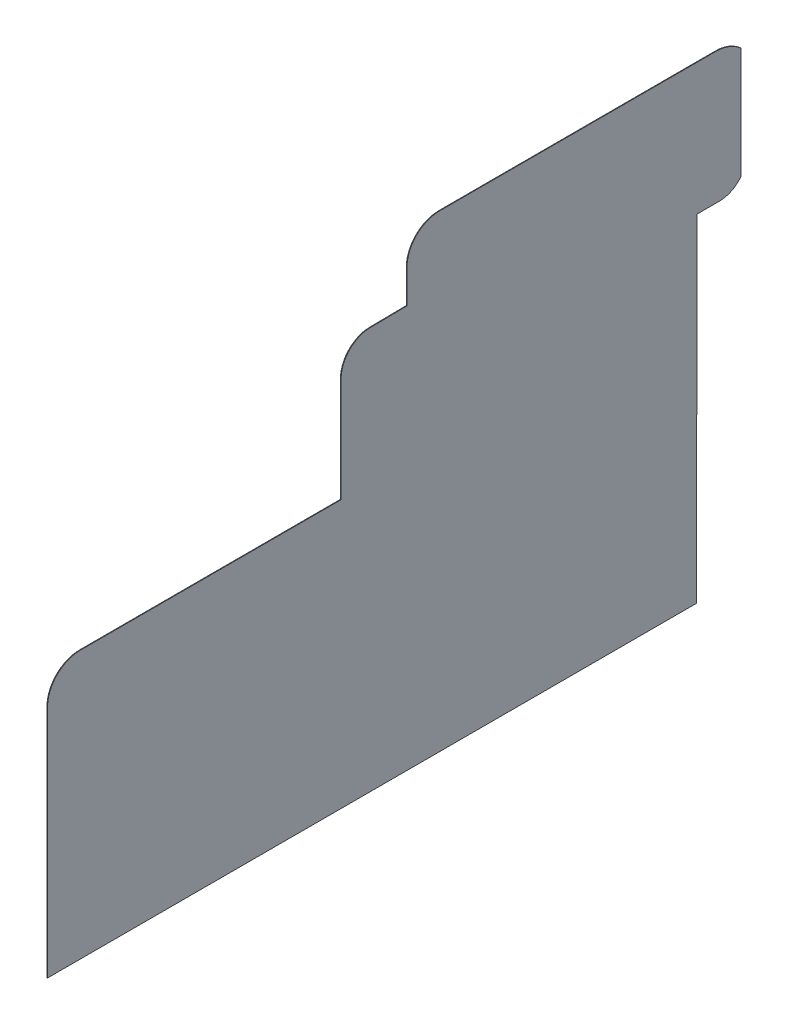
ISO-10303-21;
HEADER;
FILE_DESCRIPTION(('STEP AP214'),'2;1');
FILE_NAME('part.step','',(''),(''),'','','');
FILE_SCHEMA(('AUTOMOTIVE_DESIGN { 1 0 10303 214 1 1 1 1 }'));
ENDSEC;
DATA;
#1=APPLICATION_CONTEXT('core data for automotive mechanical design processes');
#2=APPLICATION_PROTOCOL_DEFINITION('international standard','automotive_design',2000,#1);
#3=PRODUCT_CONTEXT('',#1,'mechanical');
#4=PRODUCT('Part','Part','',(#3));
#5=PRODUCT_RELATED_PRODUCT_CATEGORY('part','',(#4));
#6=PRODUCT_DEFINITION_FORMATION('','',#4);
#7=PRODUCT_DEFINITION_CONTEXT('part definition',#1,'design');
#8=PRODUCT_DEFINITION('design','',#6,#7);
#9=PRODUCT_DEFINITION_SHAPE('','',#8);
#10=(LENGTH_UNIT() NAMED_UNIT(*) SI_UNIT(.MILLI.,.METRE.));
#11=(NAMED_UNIT(*) PLANE_ANGLE_UNIT() SI_UNIT($,.RADIAN.));
#12=(NAMED_UNIT(*) SI_UNIT($,.STERADIAN.) SOLID_ANGLE_UNIT());
#13=UNCERTAINTY_MEASURE_WITH_UNIT(LENGTH_MEASURE(1.E-05),#10,'distance_accuracy_value','');
#14=(GEOMETRIC_REPRESENTATION_CONTEXT(3) GLOBAL_UNCERTAINTY_ASSIGNED_CONTEXT((#13)) GLOBAL_UNIT_ASSIGNED_CONTEXT((#10,
#11,#12)) REPRESENTATION_CONTEXT('',''));
#15=CARTESIAN_POINT('',(0.,0.,0.));
#16=DIRECTION('',(0.,0.,1.));
#17=DIRECTION('',(1.,0.,0.));
#18=AXIS2_PLACEMENT_3D('',#15,#16,#17);
#19=CARTESIAN_POINT('',(0.001,0.617565449706493,0.598278303098278));
#20=DIRECTION('',(-1.,0.,0.));
#21=DIRECTION('',(0.,0.,1.));
#22=AXIS2_PLACEMENT_3D('',#19,#20,#21);
#23=CYLINDRICAL_SURFACE('',#22,0.047922387511738);
#24=CARTESIAN_POINT('',(0.,0.617565449706493,0.598278303098278));
#25=DIRECTION('',(1.,0.,0.));
#26=DIRECTION('',(0.,0.,-1.));
#27=AXIS2_PLACEMENT_3D('',#24,#25,#26);
#28=CIRCLE('',#27,0.047922387511738);
#29=CARTESIAN_POINT('',(0.,0.665484439081846,0.598848988712254));
#30=VERTEX_POINT('',#29);
#31=CARTESIAN_POINT('',(0.,0.617565449706493,0.646200690610016));
#32=VERTEX_POINT('',#31);
#33=EDGE_CURVE('E181',#30,#32,#28,.T.);
#34=ORIENTED_EDGE('',*,*,#33,.T.);
#35=DIRECTION('',(-1.,0.,0.));
#36=VECTOR('',#35,1.);
#37=CARTESIAN_POINT('',(0.001,0.617565449706493,0.646200690610016));
#38=LINE('',#37,#36);
#39=CARTESIAN_POINT('',(0.001,0.617565449706493,0.646200690610016));
#40=VERTEX_POINT('',#39);
#41=EDGE_CURVE('E11',#40,#32,#38,.T.);
#42=ORIENTED_EDGE('',*,*,#41,.F.);
#43=CARTESIAN_POINT('',(0.001,0.617565449706493,0.598278303098278));
#44=DIRECTION('',(1.,0.,0.));
#45=DIRECTION('',(0.,0.,-1.));
#46=AXIS2_PLACEMENT_3D('',#43,#44,#45);
#47=CIRCLE('',#46,0.047922387511738);
#48=CARTESIAN_POINT('',(0.001,0.665484439081846,0.598848988712254));
#49=VERTEX_POINT('',#48);
#50=EDGE_CURVE('E209',#49,#40,#47,.T.);
#51=ORIENTED_EDGE('',*,*,#50,.F.);
#52=DIRECTION('',(-1.,0.,0.));
#53=VECTOR('',#52,1.);
#54=CARTESIAN_POINT('',(0.001,0.665484439081846,0.598848988712254));
#55=LINE('',#54,#53);
#56=EDGE_CURVE('E177',#49,#30,#55,.T.);
#57=ORIENTED_EDGE('',*,*,#56,.T.);
#58=EDGE_LOOP('',(#34,#42,#51,#57));
#59=FACE_BOUND('',#58,.T.);
#60=ADVANCED_FACE('F43',(#59),#23,.T.);
#61=CARTESIAN_POINT('',(0.001,0.617565449706493,0.646200690610016));
#62=DIRECTION('',(0.,0.,-1.));
#63=DIRECTION('',(0.,1.,0.));
#64=AXIS2_PLACEMENT_3D('',#61,#62,#63);
#65=PLANE('',#64);
#66=DIRECTION('',(0.,-1.,0.));
#67=VECTOR('',#66,1.);
#68=CARTESIAN_POINT('',(0.,0.617565449706493,0.646200690610016));
#69=LINE('',#68,#67);
#70=CARTESIAN_POINT('',(0.,0.448266137491081,0.646200690610016));
#71=VERTEX_POINT('',#70);
#72=EDGE_CURVE('E184',#32,#71,#69,.T.);
#73=ORIENTED_EDGE('',*,*,#72,.T.);
#74=DIRECTION('',(-1.,0.,0.));
#75=VECTOR('',#74,1.);
#76=CARTESIAN_POINT('',(0.001,0.448266137491081,0.646200690610016));
#77=LINE('',#76,#75);
#78=CARTESIAN_POINT('',(0.001,0.448266137491081,0.646200690610016));
#79=VERTEX_POINT('',#78);
#80=EDGE_CURVE('E51',#79,#71,#77,.T.);
#81=ORIENTED_EDGE('',*,*,#80,.F.);
#82=DIRECTION('',(0.,-1.,0.));
#83=VECTOR('',#82,1.);
#84=CARTESIAN_POINT('',(0.001,0.617565449706493,0.646200690610016));
#85=LINE('',#84,#83);
#86=EDGE_CURVE('E123',#40,#79,#85,.T.);
#87=ORIENTED_EDGE('',*,*,#86,.F.);
#88=ORIENTED_EDGE('',*,*,#41,.T.);
#89=EDGE_LOOP('',(#73,#81,#87,#88));
#90=FACE_BOUND('',#89,.T.);
#91=ADVANCED_FACE('F302',(#90),#65,.F.);
#92=CARTESIAN_POINT('',(0.001,0.448266137491081,1.06757272863481));
#93=DIRECTION('',(0.,-1.,0.));
#94=DIRECTION('',(0.,0.,-1.));
#95=AXIS2_PLACEMENT_3D('',#92,#93,#94);
#96=PLANE('',#95);
#97=DIRECTION('',(0.,0.,1.));
#98=VECTOR('',#97,1.);
#99=CARTESIAN_POINT('',(0.,0.448266137491081,1.06757272863481));
#100=LINE('',#99,#98);
#101=CARTESIAN_POINT('',(0.,0.448266137491081,1.06757272863481));
#102=VERTEX_POINT('',#101);
#103=EDGE_CURVE('E186',#71,#102,#100,.T.);
#104=ORIENTED_EDGE('',*,*,#103,.T.);
#105=DIRECTION('',(-1.,0.,0.));
#106=VECTOR('',#105,1.);
#107=CARTESIAN_POINT('',(0.001,0.448266137491081,1.06757272863481));
#108=LINE('',#107,#106);
#109=CARTESIAN_POINT('',(0.001,0.448266137491081,1.06757272863481));
#110=VERTEX_POINT('',#109);
#111=EDGE_CURVE('E237',#110,#102,#108,.T.);
#112=ORIENTED_EDGE('',*,*,#111,.F.);
#113=DIRECTION('',(0.,0.,1.));
#114=VECTOR('',#113,1.);
#115=CARTESIAN_POINT('',(0.001,0.448266137491081,1.06757272863481));
#116=LINE('',#115,#114);
#117=EDGE_CURVE('E245',#79,#110,#116,.T.);
#118=ORIENTED_EDGE('',*,*,#117,.F.);
#119=ORIENTED_EDGE('',*,*,#80,.T.);
#120=EDGE_LOOP('',(#104,#112,#118,#119));
#121=FACE_BOUND('',#120,.T.);
#122=ADVANCED_FACE('F243',(#121),#96,.F.);
#123=CARTESIAN_POINT('',(0.001,0.395388308892973,1.06757272863481));
#124=DIRECTION('',(-1.,0.,0.));
#125=DIRECTION('',(0.,0.,1.));
#126=AXIS2_PLACEMENT_3D('',#123,#124,#125);
#127=CYLINDRICAL_SURFACE('',#126,0.0528778285981081);
#128=CARTESIAN_POINT('',(0.,0.395388308892973,1.06757272863481));
#129=DIRECTION('',(1.,0.,0.));
#130=DIRECTION('',(0.,0.,-1.));
#131=AXIS2_PLACEMENT_3D('',#128,#129,#130);
#132=CIRCLE('',#131,0.0528778285981081);
#133=CARTESIAN_POINT('',(0.,0.395388308892973,1.12045055723292));
#134=VERTEX_POINT('',#133);
#135=EDGE_CURVE('E188',#102,#134,#132,.T.);
#136=ORIENTED_EDGE('',*,*,#135,.T.);
#137=DIRECTION('',(-1.,0.,0.));
#138=VECTOR('',#137,1.);
#139=CARTESIAN_POINT('',(0.001,0.395388308892973,1.12045055723292));
#140=LINE('',#139,#138);
#141=CARTESIAN_POINT('',(0.001,0.395388308892973,1.12045055723292));
#142=VERTEX_POINT('',#141);
#143=EDGE_CURVE('E234',#142,#134,#140,.T.);
#144=ORIENTED_EDGE('',*,*,#143,.F.);
#145=CARTESIAN_POINT('',(0.001,0.395388308892973,1.06757272863481));
#146=DIRECTION('',(1.,0.,0.));
#147=DIRECTION('',(0.,0.,-1.));
#148=AXIS2_PLACEMENT_3D('',#145,#146,#147);
#149=CIRCLE('',#148,0.0528778285981081);
#150=EDGE_CURVE('E263',#110,#142,#149,.T.);
#151=ORIENTED_EDGE('',*,*,#150,.F.);
#152=ORIENTED_EDGE('',*,*,#111,.T.);
#153=EDGE_LOOP('',(#136,#144,#151,#152));
#154=FACE_BOUND('',#153,.T.);
#155=ADVANCED_FACE('F254',(#154),#127,.T.);
#156=CARTESIAN_POINT('',(0.001,0.0160830449312925,1.12045055723292));
#157=DIRECTION('',(0.,0.,-1.));
#158=DIRECTION('',(-1.,0.,0.));
#159=AXIS2_PLACEMENT_3D('',#156,#157,#158);
#160=PLANE('',#159);
#161=DIRECTION('',(0.,-1.,0.));
#162=VECTOR('',#161,1.);
#163=CARTESIAN_POINT('',(0.,0.0160830449312925,1.12045055723292));
#164=LINE('',#163,#162);
#165=CARTESIAN_POINT('',(0.,0.0160830449312925,1.12045055723292));
#166=VERTEX_POINT('',#165);
#167=EDGE_CURVE('E190',#134,#166,#164,.T.);
#168=ORIENTED_EDGE('',*,*,#167,.T.);
#169=DIRECTION('',(-1.,0.,0.));
#170=VECTOR('',#169,1.);
#171=CARTESIAN_POINT('',(0.001,0.0160830449312925,1.12045055723292));
#172=LINE('',#171,#170);
#173=CARTESIAN_POINT('',(0.001,0.0160830449312925,1.12045055723292));
#174=VERTEX_POINT('',#173);
#175=EDGE_CURVE('E231',#174,#166,#172,.T.);
#176=ORIENTED_EDGE('',*,*,#175,.F.);
#177=DIRECTION('',(0.,-1.,0.));
#178=VECTOR('',#177,1.);
#179=CARTESIAN_POINT('',(0.001,0.0160830449312925,1.12045055723292));
#180=LINE('',#179,#178);
#181=EDGE_CURVE('E260',#142,#174,#180,.T.);
#182=ORIENTED_EDGE('',*,*,#181,.F.);
#183=ORIENTED_EDGE('',*,*,#143,.T.);
#184=EDGE_LOOP('',(#168,#176,#182,#183));
#185=FACE_BOUND('',#184,.T.);
#186=ADVANCED_FACE('F258',(#185),#160,.F.);
#187=CARTESIAN_POINT('',(0.001,0.0160830449312925,1.12045055723292));
#188=DIRECTION('',(0.,1.,0.));
#189=DIRECTION('',(0.,0.,1.));
#190=AXIS2_PLACEMENT_3D('',#187,#188,#189);
#191=PLANE('',#190);
#192=DIRECTION('',(0.,0.,-1.));
#193=VECTOR('',#192,1.);
#194=CARTESIAN_POINT('',(0.,0.0160830449312925,1.12045055723292));
#195=LINE('',#194,#193);
#196=CARTESIAN_POINT('',(0.,0.0160830449312925,0.0719620734453201));
#197=VERTEX_POINT('',#196);
#198=EDGE_CURVE('E192',#166,#197,#195,.T.);
#199=ORIENTED_EDGE('',*,*,#198,.T.);
#200=DIRECTION('',(-1.,0.,0.));
#201=VECTOR('',#200,1.);
#202=CARTESIAN_POINT('',(0.001,0.0160830449312925,0.0719620734453201));
#203=LINE('',#202,#201);
#204=CARTESIAN_POINT('',(0.001,0.0160830449312925,0.0719620734453201));
#205=VERTEX_POINT('',#204);
#206=EDGE_CURVE('E228',#205,#197,#203,.T.);
#207=ORIENTED_EDGE('',*,*,#206,.F.);
#208=DIRECTION('',(0.,0.,-1.));
#209=VECTOR('',#208,1.);
#210=CARTESIAN_POINT('',(0.001,0.0160830449312925,1.12045055723292));
#211=LINE('',#210,#209);
#212=EDGE_CURVE('E262',#174,#205,#211,.T.);
#213=ORIENTED_EDGE('',*,*,#212,.F.);
#214=ORIENTED_EDGE('',*,*,#175,.T.);
#215=EDGE_LOOP('',(#199,#207,#213,#214));
#216=FACE_BOUND('',#215,.T.);
#217=ADVANCED_FACE('F315',(#216),#191,.F.);
#218=CARTESIAN_POINT('',(0.001,0.560205340385437,0.0712221041321754));
#219=DIRECTION('',(0.,0.001359930727104,0.999999075293781));
#220=DIRECTION('',(0.,-0.999999075293781,0.001359930727104));
#221=AXIS2_PLACEMENT_3D('',#218,#219,#220);
#222=PLANE('',#221);
#223=DIRECTION('',(0.,0.999999075293781,-0.001359930727104));
#224=VECTOR('',#223,1.);
#225=CARTESIAN_POINT('',(0.,0.560205340385437,0.0712221041321754));
#226=LINE('',#225,#224);
#227=CARTESIAN_POINT('',(0.,0.560205340385437,0.0712221041321754));
#228=VERTEX_POINT('',#227);
#229=EDGE_CURVE('E194',#197,#228,#226,.T.);
#230=ORIENTED_EDGE('',*,*,#229,.T.);
#231=DIRECTION('',(-1.,0.,0.));
#232=VECTOR('',#231,1.);
#233=CARTESIAN_POINT('',(0.001,0.560205340385437,0.0712221041321754));
#234=LINE('',#233,#232);
#235=CARTESIAN_POINT('',(0.001,0.560205340385437,0.0712221041321754));
#236=VERTEX_POINT('',#235);
#237=EDGE_CURVE('E225',#236,#228,#234,.T.);
#238=ORIENTED_EDGE('',*,*,#237,.F.);
#239=DIRECTION('',(0.,0.999999075293781,-0.001359930727104));
#240=VECTOR('',#239,1.);
#241=CARTESIAN_POINT('',(0.001,0.560205340385437,0.0712221041321754));
#242=LINE('',#241,#240);
#243=EDGE_CURVE('E265',#205,#236,#242,.T.);
#244=ORIENTED_EDGE('',*,*,#243,.F.);
#245=ORIENTED_EDGE('',*,*,#206,.T.);
#246=EDGE_LOOP('',(#230,#238,#244,#245));
#247=FACE_BOUND('',#246,.T.);
#248=ADVANCED_FACE('F318',(#247),#222,.F.);
#249=CARTESIAN_POINT('',(0.001,0.560205340385437,0.035147663205862));
#250=DIRECTION('',(0.,1.,0.));
#251=DIRECTION('',(0.,0.,1.));
#252=AXIS2_PLACEMENT_3D('',#249,#250,#251);
#253=PLANE('',#252);
#254=DIRECTION('',(0.,0.,-1.));
#255=VECTOR('',#254,1.);
#256=CARTESIAN_POINT('',(0.,0.560205340385437,0.035147663205862));
#257=LINE('',#256,#255);
#258=CARTESIAN_POINT('',(0.,0.560205340385437,0.035147663205862));
#259=VERTEX_POINT('',#258);
#260=EDGE_CURVE('E196',#228,#259,#257,.T.);
#261=ORIENTED_EDGE('',*,*,#260,.T.);
#262=DIRECTION('',(-1.,0.,0.));
#263=VECTOR('',#262,1.);
#264=CARTESIAN_POINT('',(0.001,0.560205340385437,0.035147663205862));
#265=LINE('',#264,#263);
#266=CARTESIAN_POINT('',(0.001,0.560205340385437,0.035147663205862));
#267=VERTEX_POINT('',#266);
#268=EDGE_CURVE('E222',#267,#259,#265,.T.);
#269=ORIENTED_EDGE('',*,*,#268,.F.);
#270=DIRECTION('',(0.,0.,-1.));
#271=VECTOR('',#270,1.);
#272=CARTESIAN_POINT('',(0.001,0.560205340385437,0.035147663205862));
#273=LINE('',#272,#271);
#274=EDGE_CURVE('E271',#236,#267,#273,.T.);
#275=ORIENTED_EDGE('',*,*,#274,.F.);
#276=ORIENTED_EDGE('',*,*,#237,.T.);
#277=EDGE_LOOP('',(#261,#269,#275,#276));
#278=FACE_BOUND('',#277,.T.);
#279=ADVANCED_FACE('F322',(#278),#253,.F.);
#280=CARTESIAN_POINT('',(0.001,0.604479450122509,0.035147663205862));
#281=DIRECTION('',(-1.,0.,0.));
#282=DIRECTION('',(0.,0.,1.));
#283=AXIS2_PLACEMENT_3D('',#280,#281,#282);
#284=CYLINDRICAL_SURFACE('',#283,0.0442741097370722);
#285=CARTESIAN_POINT('',(0.,0.604479450122509,0.035147663205862));
#286=DIRECTION('',(1.,0.,0.));
#287=DIRECTION('',(0.,0.,-1.));
#288=AXIS2_PLACEMENT_3D('',#285,#286,#287);
#289=CIRCLE('',#288,0.0442741097370722);
#290=CARTESIAN_POINT('',(0.,0.577556624041698,0.));
#291=VERTEX_POINT('',#290);
#292=EDGE_CURVE('E198',#259,#291,#289,.T.);
#293=ORIENTED_EDGE('',*,*,#292,.T.);
#294=DIRECTION('',(-1.,0.,0.));
#295=VECTOR('',#294,1.);
#296=CARTESIAN_POINT('',(0.001,0.577556624041698,0.));
#297=LINE('',#296,#295);
#298=CARTESIAN_POINT('',(0.001,0.577556624041698,0.));
#299=VERTEX_POINT('',#298);
#300=EDGE_CURVE('E219',#299,#291,#297,.T.);
#301=ORIENTED_EDGE('',*,*,#300,.F.);
#302=CARTESIAN_POINT('',(0.001,0.604479450122509,0.035147663205862));
#303=DIRECTION('',(1.,0.,0.));
#304=DIRECTION('',(0.,0.,-1.));
#305=AXIS2_PLACEMENT_3D('',#302,#303,#304);
#306=CIRCLE('',#305,0.0442741097370722);
#307=EDGE_CURVE('E273',#267,#299,#306,.T.);
#308=ORIENTED_EDGE('',*,*,#307,.F.);
#309=ORIENTED_EDGE('',*,*,#268,.T.);
#310=EDGE_LOOP('',(#293,#301,#308,#309));
#311=FACE_BOUND('',#310,.T.);
#312=ADVANCED_FACE('F326',(#311),#284,.T.);
#313=CARTESIAN_POINT('',(0.001,0.756828486919403,0.));
#314=DIRECTION('',(0.,0.,1.));
#315=DIRECTION('',(0.,-1.,0.));
#316=AXIS2_PLACEMENT_3D('',#313,#314,#315);
#317=PLANE('',#316);
#318=DIRECTION('',(0.,1.,0.));
#319=VECTOR('',#318,1.);
#320=CARTESIAN_POINT('',(0.,0.756828486919403,0.));
#321=LINE('',#320,#319);
#322=CARTESIAN_POINT('',(0.,0.756828486919403,0.));
#323=VERTEX_POINT('',#322);
#324=EDGE_CURVE('E200',#291,#323,#321,.T.);
#325=ORIENTED_EDGE('',*,*,#324,.T.);
#326=DIRECTION('',(-1.,0.,0.));
#327=VECTOR('',#326,1.);
#328=CARTESIAN_POINT('',(0.001,0.756828486919403,0.));
#329=LINE('',#328,#327);
#330=CARTESIAN_POINT('',(0.001,0.756828486919403,0.));
#331=VERTEX_POINT('',#330);
#332=EDGE_CURVE('E216',#331,#323,#329,.T.);
#333=ORIENTED_EDGE('',*,*,#332,.F.);
#334=DIRECTION('',(0.,1.,0.));
#335=VECTOR('',#334,1.);
#336=CARTESIAN_POINT('',(0.001,0.756828486919403,0.));
#337=LINE('',#336,#335);
#338=EDGE_CURVE('E275',#299,#331,#337,.T.);
#339=ORIENTED_EDGE('',*,*,#338,.F.);
#340=ORIENTED_EDGE('',*,*,#300,.T.);
#341=EDGE_LOOP('',(#325,#333,#339,#340));
#342=FACE_BOUND('',#341,.T.);
#343=ADVANCED_FACE('F330',(#342),#317,.F.);
#344=CARTESIAN_POINT('',(0.001,0.711730574750211,0.0410671532154083));
#345=DIRECTION('',(-1.,0.,0.));
#346=DIRECTION('',(0.,0.,1.));
#347=AXIS2_PLACEMENT_3D('',#344,#345,#346);
#348=CYLINDRICAL_SURFACE('',#347,0.0609945305354339);
#349=CARTESIAN_POINT('',(0.,0.711730574750211,0.0410671532154083));
#350=DIRECTION('',(1.,0.,0.));
#351=DIRECTION('',(0.,0.,1.));
#352=AXIS2_PLACEMENT_3D('',#349,#350,#351);
#353=CIRCLE('',#352,0.0609945305354339);
#354=CARTESIAN_POINT('',(0.,0.772725105285645,0.0410671532154083));
#355=VERTEX_POINT('',#354);
#356=EDGE_CURVE('E202',#323,#355,#353,.T.);
#357=ORIENTED_EDGE('',*,*,#356,.T.);
#358=DIRECTION('',(-1.,0.,0.));
#359=VECTOR('',#358,1.);
#360=CARTESIAN_POINT('',(0.001,0.772725105285645,0.0410671532154083));
#361=LINE('',#360,#359);
#362=CARTESIAN_POINT('',(0.001,0.772725105285645,0.0410671532154083));
#363=VERTEX_POINT('',#362);
#364=EDGE_CURVE('E213',#363,#355,#361,.T.);
#365=ORIENTED_EDGE('',*,*,#364,.F.);
#366=CARTESIAN_POINT('',(0.001,0.711730574750211,0.0410671532154083));
#367=DIRECTION('',(1.,0.,0.));
#368=DIRECTION('',(0.,0.,1.));
#369=AXIS2_PLACEMENT_3D('',#366,#367,#368);
#370=CIRCLE('',#369,0.0609945305354339);
#371=EDGE_CURVE('E277',#331,#363,#370,.T.);
#372=ORIENTED_EDGE('',*,*,#371,.F.);
#373=ORIENTED_EDGE('',*,*,#332,.T.);
#374=EDGE_LOOP('',(#357,#365,#372,#373));
#375=FACE_BOUND('',#374,.T.);
#376=ADVANCED_FACE('F283',(#375),#348,.T.);
#377=CARTESIAN_POINT('',(0.001,0.772725105285645,0.487234324216843));
#378=DIRECTION('',(0.,-1.,0.));
#379=DIRECTION('',(0.,0.,-1.));
#380=AXIS2_PLACEMENT_3D('',#377,#378,#379);
#381=PLANE('',#380);
#382=DIRECTION('',(0.,0.,1.));
#383=VECTOR('',#382,1.);
#384=CARTESIAN_POINT('',(0.,0.772725105285645,0.487234324216843));
#385=LINE('',#384,#383);
#386=CARTESIAN_POINT('',(0.,0.772725105285645,0.487234324216843));
#387=VERTEX_POINT('',#386);
#388=EDGE_CURVE('E204',#355,#387,#385,.T.);
#389=ORIENTED_EDGE('',*,*,#388,.T.);
#390=DIRECTION('',(-1.,0.,0.));
#391=VECTOR('',#390,1.);
#392=CARTESIAN_POINT('',(0.001,0.772725105285645,0.487234324216843));
#393=LINE('',#392,#391);
#394=CARTESIAN_POINT('',(0.001,0.772725105285645,0.487234324216843));
#395=VERTEX_POINT('',#394);
#396=EDGE_CURVE('E172',#395,#387,#393,.T.);
#397=ORIENTED_EDGE('',*,*,#396,.F.);
#398=DIRECTION('',(0.,0.,1.));
#399=VECTOR('',#398,1.);
#400=CARTESIAN_POINT('',(0.001,0.772725105285645,0.487234324216843));
#401=LINE('',#400,#399);
#402=EDGE_CURVE('E163',#363,#395,#401,.T.);
#403=ORIENTED_EDGE('',*,*,#402,.F.);
#404=ORIENTED_EDGE('',*,*,#364,.T.);
#405=EDGE_LOOP('',(#389,#397,#403,#404));
#406=FACE_BOUND('',#405,.T.);
#407=ADVANCED_FACE('F287',(#406),#381,.F.);
#408=CARTESIAN_POINT('',(0.001,0.720206582394945,0.487234324216843));
#409=DIRECTION('',(-1.,0.,0.));
#410=DIRECTION('',(0.,0.,1.));
#411=AXIS2_PLACEMENT_3D('',#408,#409,#410);
#412=CYLINDRICAL_SURFACE('',#411,0.0525185228907);
#413=CARTESIAN_POINT('',(0.,0.720206582394945,0.487234324216843));
#414=DIRECTION('',(1.,0.,0.));
#415=DIRECTION('',(0.,0.,-1.));
#416=AXIS2_PLACEMENT_3D('',#413,#414,#415);
#417=CIRCLE('',#416,0.0525185228907);
#418=CARTESIAN_POINT('',(0.,0.720206582394945,0.539752847107543));
#419=VERTEX_POINT('',#418);
#420=EDGE_CURVE('E171',#387,#419,#417,.T.);
#421=ORIENTED_EDGE('',*,*,#420,.T.);
#422=DIRECTION('',(-1.,0.,0.));
#423=VECTOR('',#422,1.);
#424=CARTESIAN_POINT('',(0.001,0.720206582394945,0.539752847107543));
#425=LINE('',#424,#423);
#426=CARTESIAN_POINT('',(0.001,0.720206582394945,0.539752847107543));
#427=VERTEX_POINT('',#426);
#428=EDGE_CURVE('E168',#427,#419,#425,.T.);
#429=ORIENTED_EDGE('',*,*,#428,.F.);
#430=CARTESIAN_POINT('',(0.001,0.720206582394945,0.487234324216843));
#431=DIRECTION('',(1.,0.,0.));
#432=DIRECTION('',(0.,0.,-1.));
#433=AXIS2_PLACEMENT_3D('',#430,#431,#432);
#434=CIRCLE('',#433,0.0525185228907);
#435=EDGE_CURVE('E157',#395,#427,#434,.T.);
#436=ORIENTED_EDGE('',*,*,#435,.F.);
#437=ORIENTED_EDGE('',*,*,#396,.T.);
#438=EDGE_LOOP('',(#421,#429,#436,#437));
#439=FACE_BOUND('',#438,.T.);
#440=ADVANCED_FACE('F169',(#439),#412,.T.);
#441=CARTESIAN_POINT('',(0.001,0.666188237686428,0.539752847107543));
#442=DIRECTION('',(0.,0.,-1.));
#443=DIRECTION('',(-1.,0.,0.));
#444=AXIS2_PLACEMENT_3D('',#441,#442,#443);
#445=PLANE('',#444);
#446=DIRECTION('',(0.,-1.,0.));
#447=VECTOR('',#446,1.);
#448=CARTESIAN_POINT('',(0.,0.666188237686428,0.539752847107543));
#449=LINE('',#448,#447);
#450=CARTESIAN_POINT('',(0.,0.666188237686428,0.539752847107543));
#451=VERTEX_POINT('',#450);
#452=EDGE_CURVE('E109',#419,#451,#449,.T.);
#453=ORIENTED_EDGE('',*,*,#452,.T.);
#454=DIRECTION('',(-1.,0.,0.));
#455=VECTOR('',#454,1.);
#456=CARTESIAN_POINT('',(0.001,0.666188237686428,0.539752847107543));
#457=LINE('',#456,#455);
#458=CARTESIAN_POINT('',(0.001,0.666188237686428,0.539752847107543));
#459=VERTEX_POINT('',#458);
#460=EDGE_CURVE('E173',#459,#451,#457,.T.);
#461=ORIENTED_EDGE('',*,*,#460,.F.);
#462=DIRECTION('',(0.,-1.,0.));
#463=VECTOR('',#462,1.);
#464=CARTESIAN_POINT('',(0.001,0.666188237686428,0.539752847107543));
#465=LINE('',#464,#463);
#466=EDGE_CURVE('E161',#427,#459,#465,.T.);
#467=ORIENTED_EDGE('',*,*,#466,.F.);
#468=ORIENTED_EDGE('',*,*,#428,.T.);
#469=EDGE_LOOP('',(#453,#461,#467,#468));
#470=FACE_BOUND('',#469,.T.);
#471=ADVANCED_FACE('F175',(#470),#445,.F.);
#472=CARTESIAN_POINT('',(0.001,0.665484439081846,0.598848988712254));
#473=DIRECTION('',(0.,-0.999929090837048,-0.0119085388606103));
#474=DIRECTION('',(0.,0.0119085388606103,-0.999929090837048));
#475=AXIS2_PLACEMENT_3D('',#472,#473,#474);
#476=PLANE('',#475);
#477=DIRECTION('',(0.,-0.0119085388606103,0.999929090837048));
#478=VECTOR('',#477,1.);
#479=CARTESIAN_POINT('',(0.,0.665484439081846,0.598848988712254));
#480=LINE('',#479,#478);
#481=EDGE_CURVE('E115',#451,#30,#480,.T.);
#482=ORIENTED_EDGE('',*,*,#481,.T.);
#483=ORIENTED_EDGE('',*,*,#56,.F.);
#484=DIRECTION('',(0.,-0.0119085388606103,0.999929090837048));
#485=VECTOR('',#484,1.);
#486=CARTESIAN_POINT('',(0.001,0.665484439081846,0.598848988712254));
#487=LINE('',#486,#485);
#488=EDGE_CURVE('E59',#459,#49,#487,.T.);
#489=ORIENTED_EDGE('',*,*,#488,.F.);
#490=ORIENTED_EDGE('',*,*,#460,.T.);
#491=EDGE_LOOP('',(#482,#483,#489,#490));
#492=FACE_BOUND('',#491,.T.);
#493=ADVANCED_FACE('F291',(#492),#476,.F.);
#494=CARTESIAN_POINT('',(0.001,0.617565449706493,0.598278303098278));
#495=DIRECTION('',(1.,0.,0.));
#496=DIRECTION('',(0.,0.,-1.));
#497=AXIS2_PLACEMENT_3D('',#494,#495,#496);
#498=PLANE('',#497);
#499=ORIENTED_EDGE('',*,*,#50,.T.);
#500=ORIENTED_EDGE('',*,*,#86,.T.);
#501=ORIENTED_EDGE('',*,*,#117,.T.);
#502=ORIENTED_EDGE('',*,*,#150,.T.);
#503=ORIENTED_EDGE('',*,*,#181,.T.);
#504=ORIENTED_EDGE('',*,*,#212,.T.);
#505=ORIENTED_EDGE('',*,*,#243,.T.);
#506=ORIENTED_EDGE('',*,*,#274,.T.);
#507=ORIENTED_EDGE('',*,*,#307,.T.);
#508=ORIENTED_EDGE('',*,*,#338,.T.);
#509=ORIENTED_EDGE('',*,*,#371,.T.);
#510=ORIENTED_EDGE('',*,*,#402,.T.);
#511=ORIENTED_EDGE('',*,*,#435,.T.);
#512=ORIENTED_EDGE('',*,*,#466,.T.);
#513=ORIENTED_EDGE('',*,*,#488,.T.);
#514=EDGE_LOOP('',(#499,#500,#501,#502,#503,#504,#505,#506,#507,#508,#509,#510,#511,#512,#513));
#515=FACE_BOUND('',#514,.T.);
#516=ADVANCED_FACE('F159',(#515),#498,.T.);
#517=CARTESIAN_POINT('',(0.,0.617565449706493,0.598278303098278));
#518=DIRECTION('',(1.,0.,0.));
#519=DIRECTION('',(0.,0.,-1.));
#520=AXIS2_PLACEMENT_3D('',#517,#518,#519);
#521=PLANE('',#520);
#522=ORIENTED_EDGE('',*,*,#33,.F.);
#523=ORIENTED_EDGE('',*,*,#481,.F.);
#524=ORIENTED_EDGE('',*,*,#452,.F.);
#525=ORIENTED_EDGE('',*,*,#420,.F.);
#526=ORIENTED_EDGE('',*,*,#388,.F.);
#527=ORIENTED_EDGE('',*,*,#356,.F.);
#528=ORIENTED_EDGE('',*,*,#324,.F.);
#529=ORIENTED_EDGE('',*,*,#292,.F.);
#530=ORIENTED_EDGE('',*,*,#260,.F.);
#531=ORIENTED_EDGE('',*,*,#229,.F.);
#532=ORIENTED_EDGE('',*,*,#198,.F.);
#533=ORIENTED_EDGE('',*,*,#167,.F.);
#534=ORIENTED_EDGE('',*,*,#135,.F.);
#535=ORIENTED_EDGE('',*,*,#103,.F.);
#536=ORIENTED_EDGE('',*,*,#72,.F.);
#537=EDGE_LOOP('',(#522,#523,#524,#525,#526,#527,#528,#529,#530,#531,#532,#533,#534,#535,#536));
#538=FACE_BOUND('',#537,.T.);
#539=ADVANCED_FACE('F249',(#538),#521,.F.);
#540=CLOSED_SHELL('',(#60,#91,#122,#155,#186,#217,#248,#279,#312,#343,#376,#407,#440,#471,#493,
#516,#539));
#541=MANIFOLD_SOLID_BREP('B2',#540);
#542=ADVANCED_BREP_SHAPE_REPRESENTATION('',(#18,#541),#14);
#543=SHAPE_DEFINITION_REPRESENTATION(#9,#542);
ENDSEC;
END-ISO-10303-21;
